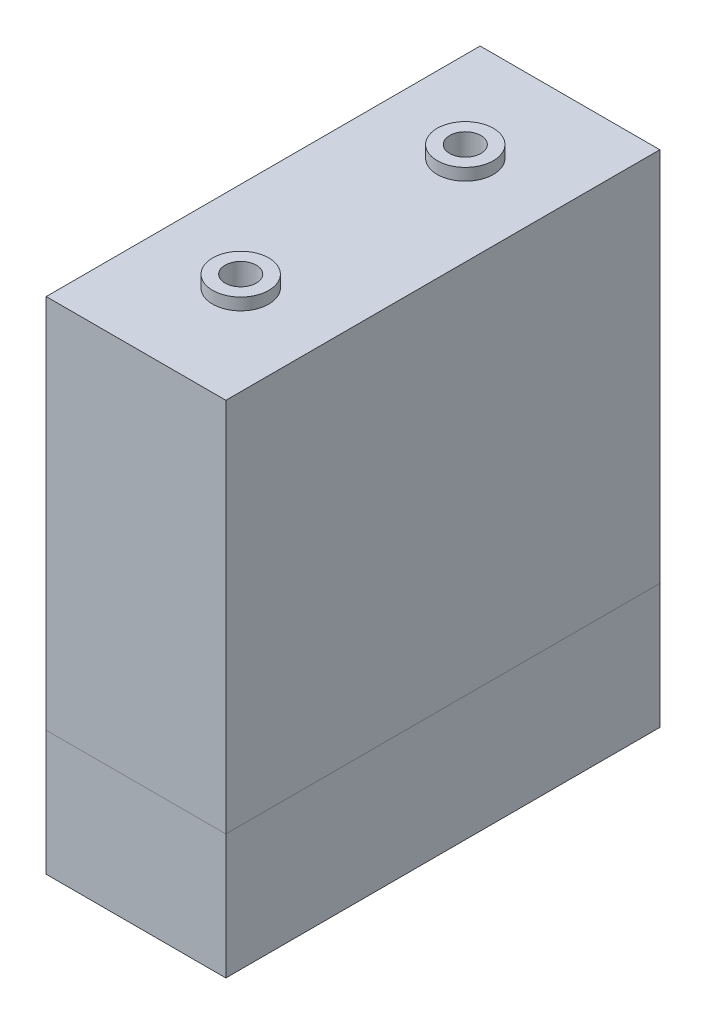
ISO-10303-21;
HEADER;
FILE_DESCRIPTION(('STEP AP214'),'2;1');
FILE_NAME('part.step','',(''),(''),'','','');
FILE_SCHEMA(('AUTOMOTIVE_DESIGN { 1 0 10303 214 1 1 1 1 }'));
ENDSEC;
DATA;
#1=APPLICATION_CONTEXT('core data for automotive mechanical design processes');
#2=APPLICATION_PROTOCOL_DEFINITION('international standard','automotive_design',2000,#1);
#3=PRODUCT_CONTEXT('',#1,'mechanical');
#4=PRODUCT('Part','Part','',(#3));
#5=PRODUCT_RELATED_PRODUCT_CATEGORY('part','',(#4));
#6=PRODUCT_DEFINITION_FORMATION('','',#4);
#7=PRODUCT_DEFINITION_CONTEXT('part definition',#1,'design');
#8=PRODUCT_DEFINITION('design','',#6,#7);
#9=PRODUCT_DEFINITION_SHAPE('','',#8);
#10=(LENGTH_UNIT() NAMED_UNIT(*) SI_UNIT(.MILLI.,.METRE.));
#11=(NAMED_UNIT(*) PLANE_ANGLE_UNIT() SI_UNIT($,.RADIAN.));
#12=(NAMED_UNIT(*) SI_UNIT($,.STERADIAN.) SOLID_ANGLE_UNIT());
#13=UNCERTAINTY_MEASURE_WITH_UNIT(LENGTH_MEASURE(1.E-05),#10,'distance_accuracy_value','');
#14=(GEOMETRIC_REPRESENTATION_CONTEXT(3) GLOBAL_UNCERTAINTY_ASSIGNED_CONTEXT((#13)) GLOBAL_UNIT_ASSIGNED_CONTEXT((#10,
#11,#12)) REPRESENTATION_CONTEXT('',''));
#15=CARTESIAN_POINT('',(0.,0.,0.));
#16=DIRECTION('',(0.,0.,1.));
#17=DIRECTION('',(1.,0.,0.));
#18=AXIS2_PLACEMENT_3D('',#15,#16,#17);
#19=CARTESIAN_POINT('',(0.,50.,0.));
#20=DIRECTION('',(0.,-1.,0.));
#21=DIRECTION('',(0.,0.,-1.));
#22=AXIS2_PLACEMENT_3D('',#19,#20,#21);
#23=PLANE('',#22);
#24=DIRECTION('',(-1.,0.,0.));
#25=VECTOR('',#24,1.);
#26=CARTESIAN_POINT('',(0.,50.,0.));
#27=LINE('',#26,#25);
#28=CARTESIAN_POINT('',(72.,50.,0.));
#29=VERTEX_POINT('',#28);
#30=CARTESIAN_POINT('',(0.,50.,0.));
#31=VERTEX_POINT('',#30);
#32=EDGE_CURVE('E105',#29,#31,#27,.T.);
#33=ORIENTED_EDGE('',*,*,#32,.T.);
#34=DIRECTION('',(0.,0.,-1.));
#35=VECTOR('',#34,1.);
#36=CARTESIAN_POINT('',(0.,50.,0.));
#37=LINE('',#36,#35);
#38=CARTESIAN_POINT('',(0.,50.,-173.9));
#39=VERTEX_POINT('',#38);
#40=EDGE_CURVE('E92',#31,#39,#37,.T.);
#41=ORIENTED_EDGE('',*,*,#40,.T.);
#42=DIRECTION('',(1.,0.,0.));
#43=VECTOR('',#42,1.);
#44=CARTESIAN_POINT('',(0.,50.,-173.9));
#45=LINE('',#44,#43);
#46=CARTESIAN_POINT('',(72.,50.,-173.9));
#47=VERTEX_POINT('',#46);
#48=EDGE_CURVE('E103',#39,#47,#45,.T.);
#49=ORIENTED_EDGE('',*,*,#48,.T.);
#50=DIRECTION('',(0.,0.,1.));
#51=VECTOR('',#50,1.);
#52=CARTESIAN_POINT('',(72.,50.,0.));
#53=LINE('',#52,#51);
#54=EDGE_CURVE('E110',#47,#29,#53,.T.);
#55=ORIENTED_EDGE('',*,*,#54,.T.);
#56=EDGE_LOOP('',(#33,#41,#49,#55));
#57=FACE_BOUND('',#56,.T.);
#58=ADVANCED_FACE('F48',(#57),#23,.T.);
#59=CARTESIAN_POINT('',(0.,200.5,0.));
#60=DIRECTION('',(1.,0.,0.));
#61=DIRECTION('',(0.,0.,-1.));
#62=AXIS2_PLACEMENT_3D('',#59,#60,#61);
#63=PLANE('',#62);
#64=ORIENTED_EDGE('',*,*,#40,.F.);
#65=DIRECTION('',(0.,-1.,0.));
#66=VECTOR('',#65,1.);
#67=CARTESIAN_POINT('',(0.,200.5,0.));
#68=LINE('',#67,#66);
#69=CARTESIAN_POINT('',(0.,200.5,0.));
#70=VERTEX_POINT('',#69);
#71=EDGE_CURVE('E119',#70,#31,#68,.T.);
#72=ORIENTED_EDGE('',*,*,#71,.F.);
#73=DIRECTION('',(0.,0.,1.));
#74=VECTOR('',#73,1.);
#75=CARTESIAN_POINT('',(0.,200.5,0.));
#76=LINE('',#75,#74);
#77=CARTESIAN_POINT('',(0.,200.5,-173.9));
#78=VERTEX_POINT('',#77);
#79=EDGE_CURVE('E94',#78,#70,#76,.T.);
#80=ORIENTED_EDGE('',*,*,#79,.F.);
#81=DIRECTION('',(0.,-1.,0.));
#82=VECTOR('',#81,1.);
#83=CARTESIAN_POINT('',(0.,200.5,-173.9));
#84=LINE('',#83,#82);
#85=EDGE_CURVE('E52',#78,#39,#84,.T.);
#86=ORIENTED_EDGE('',*,*,#85,.T.);
#87=EDGE_LOOP('',(#64,#72,#80,#86));
#88=FACE_BOUND('',#87,.T.);
#89=ADVANCED_FACE('F90',(#88),#63,.F.);
#90=CARTESIAN_POINT('',(0.,200.5,0.));
#91=DIRECTION('',(0.,0.,-1.));
#92=DIRECTION('',(-1.,0.,0.));
#93=AXIS2_PLACEMENT_3D('',#90,#91,#92);
#94=PLANE('',#93);
#95=ORIENTED_EDGE('',*,*,#32,.F.);
#96=DIRECTION('',(0.,-1.,0.));
#97=VECTOR('',#96,1.);
#98=CARTESIAN_POINT('',(72.,200.5,0.));
#99=LINE('',#98,#97);
#100=CARTESIAN_POINT('',(72.,200.5,0.));
#101=VERTEX_POINT('',#100);
#102=EDGE_CURVE('E121',#101,#29,#99,.T.);
#103=ORIENTED_EDGE('',*,*,#102,.F.);
#104=DIRECTION('',(1.,0.,0.));
#105=VECTOR('',#104,1.);
#106=CARTESIAN_POINT('',(0.,200.5,0.));
#107=LINE('',#106,#105);
#108=EDGE_CURVE('E65',#70,#101,#107,.T.);
#109=ORIENTED_EDGE('',*,*,#108,.F.);
#110=ORIENTED_EDGE('',*,*,#71,.T.);
#111=EDGE_LOOP('',(#95,#103,#109,#110));
#112=FACE_BOUND('',#111,.T.);
#113=ADVANCED_FACE('F127',(#112),#94,.F.);
#114=CARTESIAN_POINT('',(72.,200.5,0.));
#115=DIRECTION('',(-1.,0.,0.));
#116=DIRECTION('',(0.,0.,1.));
#117=AXIS2_PLACEMENT_3D('',#114,#115,#116);
#118=PLANE('',#117);
#119=ORIENTED_EDGE('',*,*,#54,.F.);
#120=DIRECTION('',(0.,-1.,0.));
#121=VECTOR('',#120,1.);
#122=CARTESIAN_POINT('',(72.,200.5,-173.9));
#123=LINE('',#122,#121);
#124=CARTESIAN_POINT('',(72.,200.5,-173.9));
#125=VERTEX_POINT('',#124);
#126=EDGE_CURVE('E99',#125,#47,#123,.T.);
#127=ORIENTED_EDGE('',*,*,#126,.F.);
#128=DIRECTION('',(0.,0.,-1.));
#129=VECTOR('',#128,1.);
#130=CARTESIAN_POINT('',(72.,200.5,0.));
#131=LINE('',#130,#129);
#132=EDGE_CURVE('E126',#101,#125,#131,.T.);
#133=ORIENTED_EDGE('',*,*,#132,.F.);
#134=ORIENTED_EDGE('',*,*,#102,.T.);
#135=EDGE_LOOP('',(#119,#127,#133,#134));
#136=FACE_BOUND('',#135,.T.);
#137=ADVANCED_FACE('F125',(#136),#118,.F.);
#138=CARTESIAN_POINT('',(0.,200.5,-173.9));
#139=DIRECTION('',(0.,0.,1.));
#140=DIRECTION('',(1.,0.,0.));
#141=AXIS2_PLACEMENT_3D('',#138,#139,#140);
#142=PLANE('',#141);
#143=ORIENTED_EDGE('',*,*,#48,.F.);
#144=ORIENTED_EDGE('',*,*,#85,.F.);
#145=DIRECTION('',(-1.,0.,0.));
#146=VECTOR('',#145,1.);
#147=CARTESIAN_POINT('',(0.,200.5,-173.9));
#148=LINE('',#147,#146);
#149=EDGE_CURVE('E98',#125,#78,#148,.T.);
#150=ORIENTED_EDGE('',*,*,#149,.F.);
#151=ORIENTED_EDGE('',*,*,#126,.T.);
#152=EDGE_LOOP('',(#143,#144,#150,#151));
#153=FACE_BOUND('',#152,.T.);
#154=ADVANCED_FACE('F50',(#153),#142,.F.);
#155=CARTESIAN_POINT('',(0.,200.5,0.));
#156=DIRECTION('',(0.,-1.,0.));
#157=DIRECTION('',(0.,0.,-1.));
#158=AXIS2_PLACEMENT_3D('',#155,#156,#157);
#159=PLANE('',#158);
#160=CARTESIAN_POINT('',(36.,200.5,-41.95));
#161=DIRECTION('',(0.,-1.,0.));
#162=DIRECTION('',(0.,0.,-1.));
#163=AXIS2_PLACEMENT_3D('',#160,#161,#162);
#164=CIRCLE('',#163,11.25);
#165=CARTESIAN_POINT('',(36.,200.5,-53.2));
#166=VERTEX_POINT('',#165);
#167=EDGE_CURVE('E106',#166,#166,#164,.F.);
#168=ORIENTED_EDGE('',*,*,#167,.F.);
#169=EDGE_LOOP('',(#168));
#170=FACE_BOUND('',#169,.T.);
#171=CARTESIAN_POINT('',(36.,200.5,-131.95));
#172=DIRECTION('',(0.,-1.,0.));
#173=DIRECTION('',(0.,0.,-1.));
#174=AXIS2_PLACEMENT_3D('',#171,#172,#173);
#175=CIRCLE('',#174,11.25);
#176=CARTESIAN_POINT('',(36.,200.5,-143.2));
#177=VERTEX_POINT('',#176);
#178=EDGE_CURVE('E122',#177,#177,#175,.F.);
#179=ORIENTED_EDGE('',*,*,#178,.F.);
#180=EDGE_LOOP('',(#179));
#181=FACE_BOUND('',#180,.T.);
#182=ORIENTED_EDGE('',*,*,#79,.T.);
#183=ORIENTED_EDGE('',*,*,#108,.T.);
#184=ORIENTED_EDGE('',*,*,#132,.T.);
#185=ORIENTED_EDGE('',*,*,#149,.T.);
#186=EDGE_LOOP('',(#182,#183,#184,#185));
#187=FACE_BOUND('',#186,.T.);
#188=ADVANCED_FACE('F163',(#170,#181,#187),#159,.F.);
#189=CARTESIAN_POINT('',(36.,205.3,-131.95));
#190=DIRECTION('',(0.,-1.,0.));
#191=DIRECTION('',(0.,0.,-1.));
#192=AXIS2_PLACEMENT_3D('',#189,#190,#191);
#193=CYLINDRICAL_SURFACE('',#192,11.25);
#194=CARTESIAN_POINT('',(36.,205.3,-131.95));
#195=DIRECTION('',(0.,1.,0.));
#196=DIRECTION('',(0.,0.,1.));
#197=AXIS2_PLACEMENT_3D('',#194,#195,#196);
#198=CIRCLE('',#197,11.25);
#199=CARTESIAN_POINT('',(36.,205.3,-120.7));
#200=VERTEX_POINT('',#199);
#201=EDGE_CURVE('E57',#200,#200,#198,.T.);
#202=ORIENTED_EDGE('',*,*,#201,.F.);
#203=EDGE_LOOP('',(#202));
#204=FACE_BOUND('',#203,.T.);
#205=ORIENTED_EDGE('',*,*,#178,.T.);
#206=EDGE_LOOP('',(#205));
#207=FACE_BOUND('',#206,.T.);
#208=ADVANCED_FACE('F166',(#204,#207),#193,.T.);
#209=CARTESIAN_POINT('',(36.,205.3,-131.95));
#210=DIRECTION('',(0.,1.,0.));
#211=DIRECTION('',(0.,0.,1.));
#212=AXIS2_PLACEMENT_3D('',#209,#210,#211);
#213=PLANE('',#212);
#214=CARTESIAN_POINT('',(36.,205.3,-131.95));
#215=DIRECTION('',(0.,1.,0.));
#216=DIRECTION('',(0.,0.,1.));
#217=AXIS2_PLACEMENT_3D('',#214,#215,#216);
#218=CIRCLE('',#217,6.25000000000001);
#219=CARTESIAN_POINT('',(36.,205.3,-125.7));
#220=VERTEX_POINT('',#219);
#221=EDGE_CURVE('E139',#220,#220,#218,.T.);
#222=ORIENTED_EDGE('',*,*,#221,.F.);
#223=EDGE_LOOP('',(#222));
#224=FACE_BOUND('',#223,.T.);
#225=ORIENTED_EDGE('',*,*,#201,.T.);
#226=EDGE_LOOP('',(#225));
#227=FACE_BOUND('',#226,.T.);
#228=ADVANCED_FACE('F159',(#224,#227),#213,.T.);
#229=CARTESIAN_POINT('',(36.,205.3,-41.95));
#230=DIRECTION('',(0.,-1.,0.));
#231=DIRECTION('',(0.,0.,-1.));
#232=AXIS2_PLACEMENT_3D('',#229,#230,#231);
#233=CYLINDRICAL_SURFACE('',#232,11.25);
#234=CARTESIAN_POINT('',(36.,205.3,-41.95));
#235=DIRECTION('',(0.,1.,0.));
#236=DIRECTION('',(0.,0.,1.));
#237=AXIS2_PLACEMENT_3D('',#234,#235,#236);
#238=CIRCLE('',#237,11.25);
#239=CARTESIAN_POINT('',(36.,205.3,-30.7));
#240=VERTEX_POINT('',#239);
#241=EDGE_CURVE('E12',#240,#240,#238,.T.);
#242=ORIENTED_EDGE('',*,*,#241,.F.);
#243=EDGE_LOOP('',(#242));
#244=FACE_BOUND('',#243,.T.);
#245=ORIENTED_EDGE('',*,*,#167,.T.);
#246=EDGE_LOOP('',(#245));
#247=FACE_BOUND('',#246,.T.);
#248=ADVANCED_FACE('F153',(#244,#247),#233,.T.);
#249=CARTESIAN_POINT('',(36.,205.3,-41.95));
#250=DIRECTION('',(0.,1.,0.));
#251=DIRECTION('',(0.,0.,1.));
#252=AXIS2_PLACEMENT_3D('',#249,#250,#251);
#253=PLANE('',#252);
#254=CARTESIAN_POINT('',(36.,205.3,-41.95));
#255=DIRECTION('',(0.,1.,0.));
#256=DIRECTION('',(0.,0.,1.));
#257=AXIS2_PLACEMENT_3D('',#254,#255,#256);
#258=CIRCLE('',#257,6.25000000000001);
#259=CARTESIAN_POINT('',(36.,205.3,-35.7));
#260=VERTEX_POINT('',#259);
#261=EDGE_CURVE('E115',#260,#260,#258,.T.);
#262=ORIENTED_EDGE('',*,*,#261,.F.);
#263=EDGE_LOOP('',(#262));
#264=FACE_BOUND('',#263,.T.);
#265=ORIENTED_EDGE('',*,*,#241,.T.);
#266=EDGE_LOOP('',(#265));
#267=FACE_BOUND('',#266,.T.);
#268=ADVANCED_FACE('F150',(#264,#267),#253,.T.);
#269=CARTESIAN_POINT('',(36.,195.3,-41.95));
#270=DIRECTION('',(0.,1.,0.));
#271=DIRECTION('',(0.,0.,1.));
#272=AXIS2_PLACEMENT_3D('',#269,#270,#271);
#273=CYLINDRICAL_SURFACE('',#272,6.25000000000001);
#274=CARTESIAN_POINT('',(36.,195.3,-41.95));
#275=DIRECTION('',(0.,1.,0.));
#276=DIRECTION('',(0.,0.,1.));
#277=AXIS2_PLACEMENT_3D('',#274,#275,#276);
#278=CIRCLE('',#277,6.25000000000001);
#279=CARTESIAN_POINT('',(36.,195.3,-35.7));
#280=VERTEX_POINT('',#279);
#281=EDGE_CURVE('E111',#280,#280,#278,.T.);
#282=ORIENTED_EDGE('',*,*,#281,.F.);
#283=EDGE_LOOP('',(#282));
#284=FACE_BOUND('',#283,.T.);
#285=ORIENTED_EDGE('',*,*,#261,.T.);
#286=EDGE_LOOP('',(#285));
#287=FACE_BOUND('',#286,.T.);
#288=ADVANCED_FACE('F148',(#284,#287),#273,.F.);
#289=CARTESIAN_POINT('',(36.,195.3,-41.95));
#290=DIRECTION('',(0.,1.,0.));
#291=DIRECTION('',(0.,0.,1.));
#292=AXIS2_PLACEMENT_3D('',#289,#290,#291);
#293=PLANE('',#292);
#294=ORIENTED_EDGE('',*,*,#281,.T.);
#295=EDGE_LOOP('',(#294));
#296=FACE_BOUND('',#295,.T.);
#297=ADVANCED_FACE('F242',(#296),#293,.T.);
#298=CARTESIAN_POINT('',(36.,195.3,-131.95));
#299=DIRECTION('',(0.,1.,0.));
#300=DIRECTION('',(0.,0.,1.));
#301=AXIS2_PLACEMENT_3D('',#298,#299,#300);
#302=CYLINDRICAL_SURFACE('',#301,6.25000000000001);
#303=CARTESIAN_POINT('',(36.,195.3,-131.95));
#304=DIRECTION('',(0.,1.,0.));
#305=DIRECTION('',(0.,0.,1.));
#306=AXIS2_PLACEMENT_3D('',#303,#304,#305);
#307=CIRCLE('',#306,6.25000000000001);
#308=CARTESIAN_POINT('',(36.,195.3,-125.7));
#309=VERTEX_POINT('',#308);
#310=EDGE_CURVE('E142',#309,#309,#307,.T.);
#311=ORIENTED_EDGE('',*,*,#310,.F.);
#312=EDGE_LOOP('',(#311));
#313=FACE_BOUND('',#312,.T.);
#314=ORIENTED_EDGE('',*,*,#221,.T.);
#315=EDGE_LOOP('',(#314));
#316=FACE_BOUND('',#315,.T.);
#317=ADVANCED_FACE('F251',(#313,#316),#302,.F.);
#318=CARTESIAN_POINT('',(36.,195.3,-131.95));
#319=DIRECTION('',(0.,1.,0.));
#320=DIRECTION('',(0.,0.,1.));
#321=AXIS2_PLACEMENT_3D('',#318,#319,#320);
#322=PLANE('',#321);
#323=ORIENTED_EDGE('',*,*,#310,.T.);
#324=EDGE_LOOP('',(#323));
#325=FACE_BOUND('',#324,.T.);
#326=ADVANCED_FACE('F260',(#325),#322,.T.);
#327=CLOSED_SHELL('',(#58,#89,#113,#137,#154,#188,#208,#228,#248,#268,#288,#297,#317,#326));
#328=MANIFOLD_SOLID_BREP('B2',#327);
#329=CARTESIAN_POINT('',(0.,50.,0.));
#330=DIRECTION('',(0.,-1.,0.));
#331=DIRECTION('',(0.,0.,-1.));
#332=AXIS2_PLACEMENT_3D('',#329,#330,#331);
#333=PLANE('',#332);
#334=DIRECTION('',(-1.,0.,0.));
#335=VECTOR('',#334,1.);
#336=CARTESIAN_POINT('',(0.,50.,0.));
#337=LINE('',#336,#335);
#338=CARTESIAN_POINT('',(72.,50.,0.));
#339=VERTEX_POINT('',#338);
#340=CARTESIAN_POINT('',(0.,50.,0.));
#341=VERTEX_POINT('',#340);
#342=EDGE_CURVE('E308',#339,#341,#337,.T.);
#343=ORIENTED_EDGE('',*,*,#342,.F.);
#344=DIRECTION('',(0.,0.,1.));
#345=VECTOR('',#344,1.);
#346=CARTESIAN_POINT('',(72.,50.,0.));
#347=LINE('',#346,#345);
#348=CARTESIAN_POINT('',(72.,50.,-173.9));
#349=VERTEX_POINT('',#348);
#350=EDGE_CURVE('E321',#349,#339,#347,.T.);
#351=ORIENTED_EDGE('',*,*,#350,.F.);
#352=DIRECTION('',(1.,0.,0.));
#353=VECTOR('',#352,1.);
#354=CARTESIAN_POINT('',(0.,50.,-173.9));
#355=LINE('',#354,#353);
#356=CARTESIAN_POINT('',(0.,50.,-173.9));
#357=VERTEX_POINT('',#356);
#358=EDGE_CURVE('E348',#357,#349,#355,.T.);
#359=ORIENTED_EDGE('',*,*,#358,.F.);
#360=DIRECTION('',(0.,0.,-1.));
#361=VECTOR('',#360,1.);
#362=CARTESIAN_POINT('',(0.,50.,0.));
#363=LINE('',#362,#361);
#364=EDGE_CURVE('E46',#341,#357,#363,.T.);
#365=ORIENTED_EDGE('',*,*,#364,.F.);
#366=EDGE_LOOP('',(#343,#351,#359,#365));
#367=FACE_BOUND('',#366,.T.);
#368=ADVANCED_FACE('F301',(#367),#333,.F.);
#369=CARTESIAN_POINT('',(0.,200.5,0.));
#370=DIRECTION('',(0.,0.,-1.));
#371=DIRECTION('',(-1.,0.,0.));
#372=AXIS2_PLACEMENT_3D('',#369,#370,#371);
#373=PLANE('',#372);
#374=DIRECTION('',(0.,-1.,0.));
#375=VECTOR('',#374,1.);
#376=CARTESIAN_POINT('',(72.,200.5,0.));
#377=LINE('',#376,#375);
#378=CARTESIAN_POINT('',(72.,0.,0.));
#379=VERTEX_POINT('',#378);
#380=EDGE_CURVE('E349',#339,#379,#377,.T.);
#381=ORIENTED_EDGE('',*,*,#380,.F.);
#382=ORIENTED_EDGE('',*,*,#342,.T.);
#383=DIRECTION('',(0.,-1.,0.));
#384=VECTOR('',#383,1.);
#385=CARTESIAN_POINT('',(0.,200.5,0.));
#386=LINE('',#385,#384);
#387=CARTESIAN_POINT('',(0.,0.,0.));
#388=VERTEX_POINT('',#387);
#389=EDGE_CURVE('E340',#341,#388,#386,.T.);
#390=ORIENTED_EDGE('',*,*,#389,.T.);
#391=DIRECTION('',(1.,0.,0.));
#392=VECTOR('',#391,1.);
#393=CARTESIAN_POINT('',(0.,0.,0.));
#394=LINE('',#393,#392);
#395=EDGE_CURVE('E344',#388,#379,#394,.T.);
#396=ORIENTED_EDGE('',*,*,#395,.T.);
#397=EDGE_LOOP('',(#381,#382,#390,#396));
#398=FACE_BOUND('',#397,.T.);
#399=ADVANCED_FACE('F343',(#398),#373,.F.);
#400=CARTESIAN_POINT('',(0.,0.,0.));
#401=DIRECTION('',(0.,-1.,0.));
#402=DIRECTION('',(0.,0.,-1.));
#403=AXIS2_PLACEMENT_3D('',#400,#401,#402);
#404=PLANE('',#403);
#405=DIRECTION('',(0.,0.,1.));
#406=VECTOR('',#405,1.);
#407=CARTESIAN_POINT('',(0.,0.,0.));
#408=LINE('',#407,#406);
#409=CARTESIAN_POINT('',(0.,0.,-173.9));
#410=VERTEX_POINT('',#409);
#411=EDGE_CURVE('E355',#410,#388,#408,.T.);
#412=ORIENTED_EDGE('',*,*,#411,.F.);
#413=DIRECTION('',(-1.,0.,0.));
#414=VECTOR('',#413,1.);
#415=CARTESIAN_POINT('',(0.,0.,-173.9));
#416=LINE('',#415,#414);
#417=CARTESIAN_POINT('',(72.,0.,-173.9));
#418=VERTEX_POINT('',#417);
#419=EDGE_CURVE('E366',#418,#410,#416,.T.);
#420=ORIENTED_EDGE('',*,*,#419,.F.);
#421=DIRECTION('',(0.,0.,-1.));
#422=VECTOR('',#421,1.);
#423=CARTESIAN_POINT('',(72.,0.,0.));
#424=LINE('',#423,#422);
#425=EDGE_CURVE('E357',#379,#418,#424,.T.);
#426=ORIENTED_EDGE('',*,*,#425,.F.);
#427=ORIENTED_EDGE('',*,*,#395,.F.);
#428=EDGE_LOOP('',(#412,#420,#426,#427));
#429=FACE_BOUND('',#428,.T.);
#430=ADVANCED_FACE('F353',(#429),#404,.T.);
#431=CARTESIAN_POINT('',(72.,200.5,0.));
#432=DIRECTION('',(-1.,0.,0.));
#433=DIRECTION('',(0.,0.,1.));
#434=AXIS2_PLACEMENT_3D('',#431,#432,#433);
#435=PLANE('',#434);
#436=DIRECTION('',(0.,-1.,0.));
#437=VECTOR('',#436,1.);
#438=CARTESIAN_POINT('',(72.,200.5,-173.9));
#439=LINE('',#438,#437);
#440=EDGE_CURVE('E369',#349,#418,#439,.T.);
#441=ORIENTED_EDGE('',*,*,#440,.F.);
#442=ORIENTED_EDGE('',*,*,#350,.T.);
#443=ORIENTED_EDGE('',*,*,#380,.T.);
#444=ORIENTED_EDGE('',*,*,#425,.T.);
#445=EDGE_LOOP('',(#441,#442,#443,#444));
#446=FACE_BOUND('',#445,.T.);
#447=ADVANCED_FACE('F375',(#446),#435,.F.);
#448=CARTESIAN_POINT('',(0.,200.5,0.));
#449=DIRECTION('',(1.,0.,0.));
#450=DIRECTION('',(0.,0.,-1.));
#451=AXIS2_PLACEMENT_3D('',#448,#449,#450);
#452=PLANE('',#451);
#453=ORIENTED_EDGE('',*,*,#389,.F.);
#454=ORIENTED_EDGE('',*,*,#364,.T.);
#455=DIRECTION('',(0.,-1.,0.));
#456=VECTOR('',#455,1.);
#457=CARTESIAN_POINT('',(0.,200.5,-173.9));
#458=LINE('',#457,#456);
#459=EDGE_CURVE('E361',#357,#410,#458,.T.);
#460=ORIENTED_EDGE('',*,*,#459,.T.);
#461=ORIENTED_EDGE('',*,*,#411,.T.);
#462=EDGE_LOOP('',(#453,#454,#460,#461));
#463=FACE_BOUND('',#462,.T.);
#464=ADVANCED_FACE('F359',(#463),#452,.F.);
#465=CARTESIAN_POINT('',(0.,200.5,-173.9));
#466=DIRECTION('',(0.,0.,1.));
#467=DIRECTION('',(1.,0.,0.));
#468=AXIS2_PLACEMENT_3D('',#465,#466,#467);
#469=PLANE('',#468);
#470=ORIENTED_EDGE('',*,*,#459,.F.);
#471=ORIENTED_EDGE('',*,*,#358,.T.);
#472=ORIENTED_EDGE('',*,*,#440,.T.);
#473=ORIENTED_EDGE('',*,*,#419,.T.);
#474=EDGE_LOOP('',(#470,#471,#472,#473));
#475=FACE_BOUND('',#474,.T.);
#476=ADVANCED_FACE('F374',(#475),#469,.F.);
#477=CLOSED_SHELL('',(#368,#399,#430,#447,#464,#476));
#478=MANIFOLD_SOLID_BREP('B6',#477);
#479=ADVANCED_BREP_SHAPE_REPRESENTATION('',(#18,#328,#478),#14);
#480=SHAPE_DEFINITION_REPRESENTATION(#9,#479);
ENDSEC;
END-ISO-10303-21;
